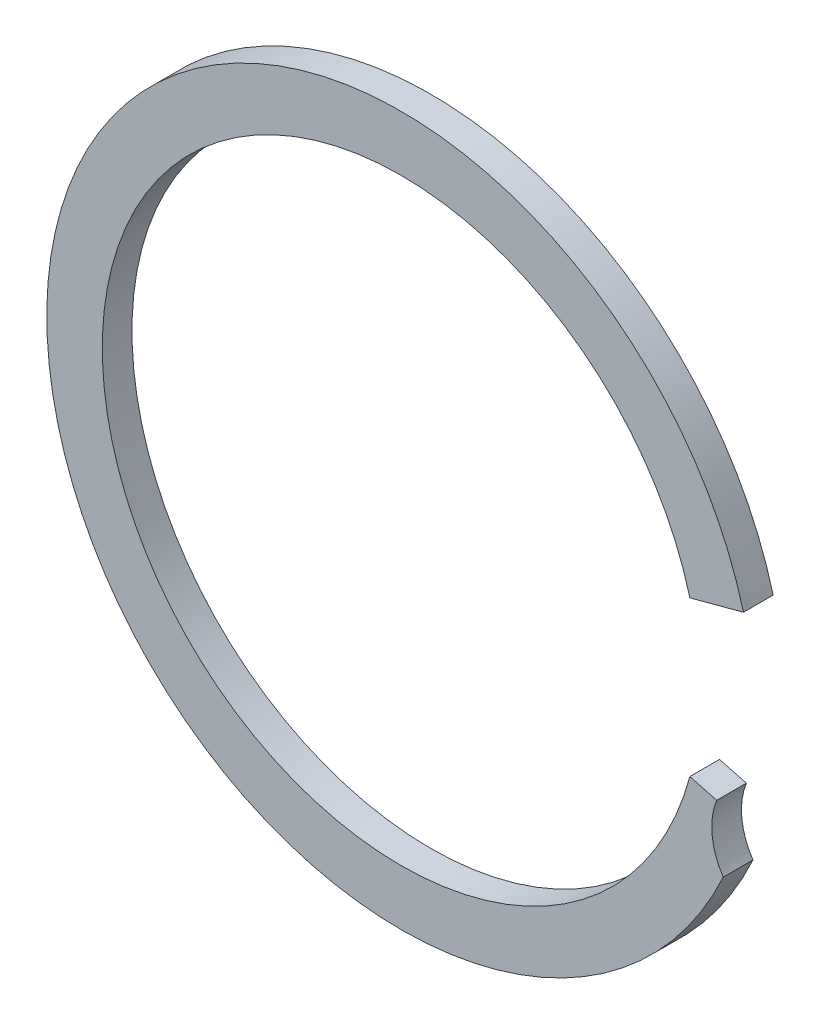
ISO-10303-21;
HEADER;
FILE_DESCRIPTION(('STEP AP214'),'2;1');
FILE_NAME('part.step','',(''),(''),'','','');
FILE_SCHEMA(('AUTOMOTIVE_DESIGN { 1 0 10303 214 1 1 1 1 }'));
ENDSEC;
DATA;
#1=APPLICATION_CONTEXT('core data for automotive mechanical design processes');
#2=APPLICATION_PROTOCOL_DEFINITION('international standard','automotive_design',2000,#1);
#3=PRODUCT_CONTEXT('',#1,'mechanical');
#4=PRODUCT('Part','Part','',(#3));
#5=PRODUCT_RELATED_PRODUCT_CATEGORY('part','',(#4));
#6=PRODUCT_DEFINITION_FORMATION('','',#4);
#7=PRODUCT_DEFINITION_CONTEXT('part definition',#1,'design');
#8=PRODUCT_DEFINITION('design','',#6,#7);
#9=PRODUCT_DEFINITION_SHAPE('','',#8);
#10=(LENGTH_UNIT() NAMED_UNIT(*) SI_UNIT(.MILLI.,.METRE.));
#11=(NAMED_UNIT(*) PLANE_ANGLE_UNIT() SI_UNIT($,.RADIAN.));
#12=(NAMED_UNIT(*) SI_UNIT($,.STERADIAN.) SOLID_ANGLE_UNIT());
#13=UNCERTAINTY_MEASURE_WITH_UNIT(LENGTH_MEASURE(1.E-05),#10,'distance_accuracy_value','');
#14=(GEOMETRIC_REPRESENTATION_CONTEXT(3) GLOBAL_UNCERTAINTY_ASSIGNED_CONTEXT((#13)) GLOBAL_UNIT_ASSIGNED_CONTEXT((#10,
#11,#12)) REPRESENTATION_CONTEXT('',''));
#15=CARTESIAN_POINT('',(0.,0.,0.));
#16=DIRECTION('',(0.,0.,1.));
#17=DIRECTION('',(1.,0.,0.));
#18=AXIS2_PLACEMENT_3D('',#15,#16,#17);
#19=CARTESIAN_POINT('',(14.6710537351815,-4.25964299977128,1.15));
#20=DIRECTION('',(0.,0.,-1.));
#21=DIRECTION('',(-1.,0.,0.));
#22=AXIS2_PLACEMENT_3D('',#19,#20,#21);
#23=CYLINDRICAL_SURFACE('',#22,2.63778621328502);
#24=CARTESIAN_POINT('',(14.6710537351815,-4.25964299977128,0.));
#25=DIRECTION('',(0.,0.,-1.));
#26=DIRECTION('',(1.,0.,0.));
#27=AXIS2_PLACEMENT_3D('',#24,#25,#26);
#28=CIRCLE('',#27,2.63778621328502);
#29=CARTESIAN_POINT('',(12.4787665698008,-5.72654214132937,0.));
#30=VERTEX_POINT('',#29);
#31=CARTESIAN_POINT('',(12.2237913316882,-3.27535501577232,0.));
#32=VERTEX_POINT('',#31);
#33=EDGE_CURVE('E106',#30,#32,#28,.T.);
#34=ORIENTED_EDGE('',*,*,#33,.T.);
#35=DIRECTION('',(0.,0.,-1.));
#36=VECTOR('',#35,1.);
#37=CARTESIAN_POINT('',(12.2237913316882,-3.27535501577232,1.15));
#38=LINE('',#37,#36);
#39=CARTESIAN_POINT('',(12.2237913316882,-3.27535501577232,1.15));
#40=VERTEX_POINT('',#39);
#41=EDGE_CURVE('E11',#40,#32,#38,.T.);
#42=ORIENTED_EDGE('',*,*,#41,.F.);
#43=CARTESIAN_POINT('',(14.6710537351815,-4.25964299977128,1.15));
#44=DIRECTION('',(0.,0.,-1.));
#45=DIRECTION('',(1.,0.,0.));
#46=AXIS2_PLACEMENT_3D('',#43,#44,#45);
#47=CIRCLE('',#46,2.63778621328502);
#48=CARTESIAN_POINT('',(12.4787665698008,-5.72654214132937,1.15));
#49=VERTEX_POINT('',#48);
#50=EDGE_CURVE('E114',#49,#40,#47,.T.);
#51=ORIENTED_EDGE('',*,*,#50,.F.);
#52=DIRECTION('',(0.,0.,-1.));
#53=VECTOR('',#52,1.);
#54=CARTESIAN_POINT('',(12.4787665698008,-5.72654214132937,1.15));
#55=LINE('',#54,#53);
#56=EDGE_CURVE('E102',#49,#30,#55,.T.);
#57=ORIENTED_EDGE('',*,*,#56,.T.);
#58=EDGE_LOOP('',(#34,#42,#51,#57));
#59=FACE_BOUND('',#58,.T.);
#60=ADVANCED_FACE('F32',(#59),#23,.F.);
#61=CARTESIAN_POINT('',(11.1854210684274,-2.99712454228712,1.15));
#62=DIRECTION('',(-0.258819045102515,-0.96592582628907,0.));
#63=DIRECTION('',(0.96592582628907,-0.258819045102515,0.));
#64=AXIS2_PLACEMENT_3D('',#61,#62,#63);
#65=PLANE('',#64);
#66=DIRECTION('',(-0.96592582628907,0.258819045102515,0.));
#67=VECTOR('',#66,1.);
#68=CARTESIAN_POINT('',(11.1854210684274,-2.99712454228712,0.));
#69=LINE('',#68,#67);
#70=CARTESIAN_POINT('',(11.1854210684274,-2.99712454228712,0.));
#71=VERTEX_POINT('',#70);
#72=EDGE_CURVE('E109',#32,#71,#69,.T.);
#73=ORIENTED_EDGE('',*,*,#72,.T.);
#74=DIRECTION('',(0.,0.,-1.));
#75=VECTOR('',#74,1.);
#76=CARTESIAN_POINT('',(11.1854210684274,-2.99712454228712,1.15));
#77=LINE('',#76,#75);
#78=CARTESIAN_POINT('',(11.1854210684274,-2.99712454228712,1.15));
#79=VERTEX_POINT('',#78);
#80=EDGE_CURVE('E40',#79,#71,#77,.T.);
#81=ORIENTED_EDGE('',*,*,#80,.F.);
#82=DIRECTION('',(-0.96592582628907,0.258819045102515,0.));
#83=VECTOR('',#82,1.);
#84=CARTESIAN_POINT('',(11.1854210684274,-2.99712454228712,1.15));
#85=LINE('',#84,#83);
#86=EDGE_CURVE('E81',#40,#79,#85,.T.);
#87=ORIENTED_EDGE('',*,*,#86,.F.);
#88=ORIENTED_EDGE('',*,*,#41,.T.);
#89=EDGE_LOOP('',(#73,#81,#87,#88));
#90=FACE_BOUND('',#89,.T.);
#91=ADVANCED_FACE('F133',(#90),#65,.F.);
#92=CARTESIAN_POINT('',(0.,0.,1.15));
#93=DIRECTION('',(0.,0.,-1.));
#94=DIRECTION('',(-1.,0.,0.));
#95=AXIS2_PLACEMENT_3D('',#92,#93,#94);
#96=CYLINDRICAL_SURFACE('',#95,11.58);
#97=CARTESIAN_POINT('',(0.,0.,0.));
#98=DIRECTION('',(0.,0.,-1.));
#99=DIRECTION('',(1.,0.,0.));
#100=AXIS2_PLACEMENT_3D('',#97,#98,#99);
#101=CIRCLE('',#100,11.58);
#102=CARTESIAN_POINT('',(11.1854210684274,2.99712454228712,0.));
#103=VERTEX_POINT('',#102);
#104=EDGE_CURVE('E97',#71,#103,#101,.T.);
#105=ORIENTED_EDGE('',*,*,#104,.T.);
#106=DIRECTION('',(0.,0.,-1.));
#107=VECTOR('',#106,1.);
#108=CARTESIAN_POINT('',(11.1854210684274,2.99712454228712,1.15));
#109=LINE('',#108,#107);
#110=CARTESIAN_POINT('',(11.1854210684274,2.99712454228712,1.15));
#111=VERTEX_POINT('',#110);
#112=EDGE_CURVE('E94',#111,#103,#109,.T.);
#113=ORIENTED_EDGE('',*,*,#112,.F.);
#114=CARTESIAN_POINT('',(0.,0.,1.15));
#115=DIRECTION('',(0.,0.,-1.));
#116=DIRECTION('',(1.,0.,0.));
#117=AXIS2_PLACEMENT_3D('',#114,#115,#116);
#118=CIRCLE('',#117,11.58);
#119=EDGE_CURVE('E85',#79,#111,#118,.T.);
#120=ORIENTED_EDGE('',*,*,#119,.F.);
#121=ORIENTED_EDGE('',*,*,#80,.T.);
#122=EDGE_LOOP('',(#105,#113,#120,#121));
#123=FACE_BOUND('',#122,.T.);
#124=ADVANCED_FACE('F95',(#123),#96,.F.);
#125=CARTESIAN_POINT('',(12.2237913316882,3.27535501577233,1.15));
#126=DIRECTION('',(-0.258819045102509,0.965925826289071,0.));
#127=DIRECTION('',(-0.965925826289071,-0.258819045102509,0.));
#128=AXIS2_PLACEMENT_3D('',#125,#126,#127);
#129=PLANE('',#128);
#130=DIRECTION('',(0.965925826289071,0.258819045102509,0.));
#131=VECTOR('',#130,1.);
#132=CARTESIAN_POINT('',(12.2237913316882,3.27535501577233,0.));
#133=LINE('',#132,#131);
#134=CARTESIAN_POINT('',(13.2621615949489,3.55358548925752,0.));
#135=VERTEX_POINT('',#134);
#136=EDGE_CURVE('E67',#103,#135,#133,.T.);
#137=ORIENTED_EDGE('',*,*,#136,.T.);
#138=DIRECTION('',(0.,0.,-1.));
#139=VECTOR('',#138,1.);
#140=CARTESIAN_POINT('',(13.2621615949489,3.55358548925752,1.15));
#141=LINE('',#140,#139);
#142=CARTESIAN_POINT('',(13.2621615949489,3.55358548925752,1.15));
#143=VERTEX_POINT('',#142);
#144=EDGE_CURVE('E98',#143,#135,#141,.T.);
#145=ORIENTED_EDGE('',*,*,#144,.F.);
#146=DIRECTION('',(0.965925826289069,0.25881904510252,0.));
#147=VECTOR('',#146,1.);
#148=CARTESIAN_POINT('',(11.1854210684274,2.99712454228712,1.15));
#149=LINE('',#148,#147);
#150=EDGE_CURVE('E89',#111,#143,#149,.T.);
#151=ORIENTED_EDGE('',*,*,#150,.F.);
#152=ORIENTED_EDGE('',*,*,#112,.T.);
#153=EDGE_LOOP('',(#137,#145,#151,#152));
#154=FACE_BOUND('',#153,.T.);
#155=ADVANCED_FACE('F100',(#154),#129,.F.);
#156=CARTESIAN_POINT('',(0.,0.,1.15));
#157=DIRECTION('',(0.,0.,-1.));
#158=DIRECTION('',(-1.,0.,0.));
#159=AXIS2_PLACEMENT_3D('',#156,#157,#158);
#160=CYLINDRICAL_SURFACE('',#159,13.73);
#161=CARTESIAN_POINT('',(0.,0.,0.));
#162=DIRECTION('',(0.,0.,1.));
#163=DIRECTION('',(1.,0.,0.));
#164=AXIS2_PLACEMENT_3D('',#161,#162,#163);
#165=CIRCLE('',#164,13.73);
#166=EDGE_CURVE('E73',#135,#30,#165,.T.);
#167=ORIENTED_EDGE('',*,*,#166,.T.);
#168=ORIENTED_EDGE('',*,*,#56,.F.);
#169=CARTESIAN_POINT('',(0.,0.,1.15));
#170=DIRECTION('',(0.,0.,1.));
#171=DIRECTION('',(1.,0.,0.));
#172=AXIS2_PLACEMENT_3D('',#169,#170,#171);
#173=CIRCLE('',#172,13.73);
#174=EDGE_CURVE('E48',#143,#49,#173,.T.);
#175=ORIENTED_EDGE('',*,*,#174,.F.);
#176=ORIENTED_EDGE('',*,*,#144,.T.);
#177=EDGE_LOOP('',(#167,#168,#175,#176));
#178=FACE_BOUND('',#177,.T.);
#179=ADVANCED_FACE('F122',(#178),#160,.T.);
#180=CARTESIAN_POINT('',(14.6710537351815,-4.25964299977128,1.15));
#181=DIRECTION('',(0.,0.,1.));
#182=DIRECTION('',(1.,0.,0.));
#183=AXIS2_PLACEMENT_3D('',#180,#181,#182);
#184=PLANE('',#183);
#185=ORIENTED_EDGE('',*,*,#50,.T.);
#186=ORIENTED_EDGE('',*,*,#86,.T.);
#187=ORIENTED_EDGE('',*,*,#119,.T.);
#188=ORIENTED_EDGE('',*,*,#150,.T.);
#189=ORIENTED_EDGE('',*,*,#174,.T.);
#190=EDGE_LOOP('',(#185,#186,#187,#188,#189));
#191=FACE_BOUND('',#190,.T.);
#192=ADVANCED_FACE('F87',(#191),#184,.T.);
#193=CARTESIAN_POINT('',(14.6710537351815,-4.25964299977128,0.));
#194=DIRECTION('',(0.,0.,1.));
#195=DIRECTION('',(1.,0.,0.));
#196=AXIS2_PLACEMENT_3D('',#193,#194,#195);
#197=PLANE('',#196);
#198=ORIENTED_EDGE('',*,*,#33,.F.);
#199=ORIENTED_EDGE('',*,*,#166,.F.);
#200=ORIENTED_EDGE('',*,*,#136,.F.);
#201=ORIENTED_EDGE('',*,*,#104,.F.);
#202=ORIENTED_EDGE('',*,*,#72,.F.);
#203=EDGE_LOOP('',(#198,#199,#200,#201,#202));
#204=FACE_BOUND('',#203,.T.);
#205=ADVANCED_FACE('F118',(#204),#197,.F.);
#206=CLOSED_SHELL('',(#60,#91,#124,#155,#179,#192,#205));
#207=MANIFOLD_SOLID_BREP('B2',#206);
#208=ADVANCED_BREP_SHAPE_REPRESENTATION('',(#18,#207),#14);
#209=SHAPE_DEFINITION_REPRESENTATION(#9,#208);
ENDSEC;
END-ISO-10303-21;
